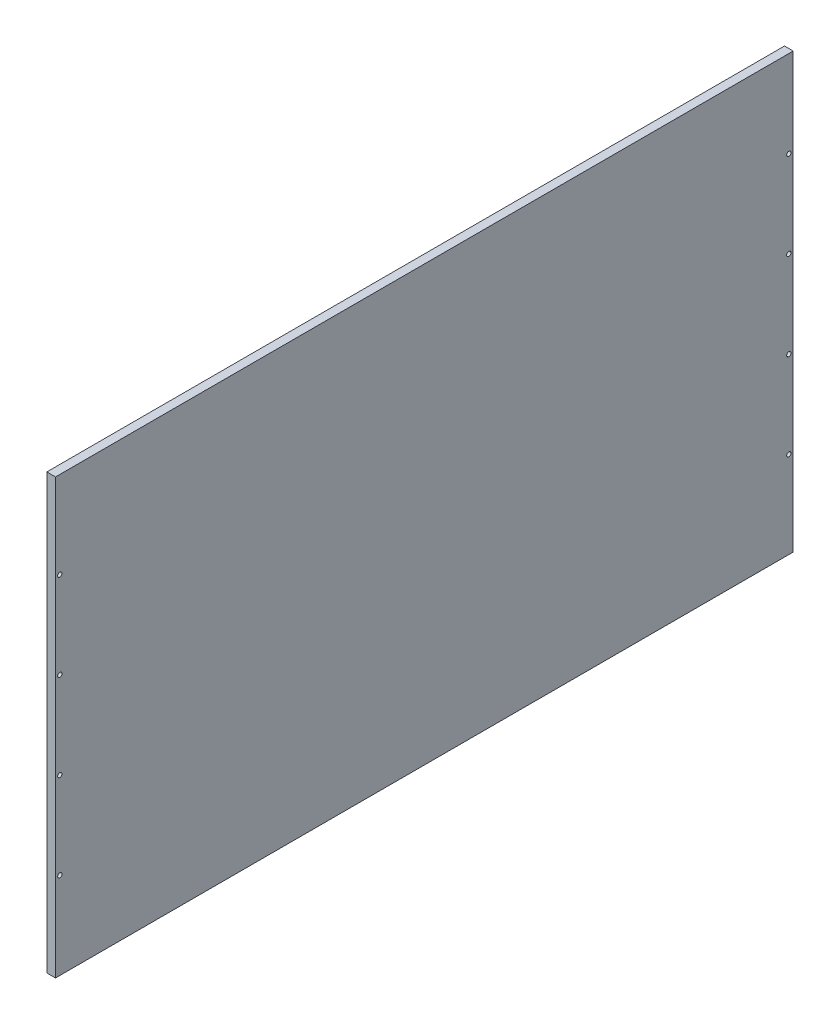
ISO-10303-21;
HEADER;
FILE_DESCRIPTION(('STEP AP214'),'2;1');
FILE_NAME('part.step','',(''),(''),'','','');
FILE_SCHEMA(('AUTOMOTIVE_DESIGN { 1 0 10303 214 1 1 1 1 }'));
ENDSEC;
DATA;
#1=APPLICATION_CONTEXT('core data for automotive mechanical design processes');
#2=APPLICATION_PROTOCOL_DEFINITION('international standard','automotive_design',2000,#1);
#3=PRODUCT_CONTEXT('',#1,'mechanical');
#4=PRODUCT('Part','Part','',(#3));
#5=PRODUCT_RELATED_PRODUCT_CATEGORY('part','',(#4));
#6=PRODUCT_DEFINITION_FORMATION('','',#4);
#7=PRODUCT_DEFINITION_CONTEXT('part definition',#1,'design');
#8=PRODUCT_DEFINITION('design','',#6,#7);
#9=PRODUCT_DEFINITION_SHAPE('','',#8);
#10=(LENGTH_UNIT() NAMED_UNIT(*) SI_UNIT(.MILLI.,.METRE.));
#11=(NAMED_UNIT(*) PLANE_ANGLE_UNIT() SI_UNIT($,.RADIAN.));
#12=(NAMED_UNIT(*) SI_UNIT($,.STERADIAN.) SOLID_ANGLE_UNIT());
#13=UNCERTAINTY_MEASURE_WITH_UNIT(LENGTH_MEASURE(1.E-05),#10,'distance_accuracy_value','');
#14=(GEOMETRIC_REPRESENTATION_CONTEXT(3) GLOBAL_UNCERTAINTY_ASSIGNED_CONTEXT((#13)) GLOBAL_UNIT_ASSIGNED_CONTEXT((#10,
#11,#12)) REPRESENTATION_CONTEXT('',''));
#15=CARTESIAN_POINT('',(0.,0.,0.));
#16=DIRECTION('',(0.,0.,1.));
#17=DIRECTION('',(1.,0.,0.));
#18=AXIS2_PLACEMENT_3D('',#15,#16,#17);
#19=CARTESIAN_POINT('',(5.,-250.,-425.));
#20=DIRECTION('',(0.,0.,1.));
#21=DIRECTION('',(1.,0.,0.));
#22=AXIS2_PLACEMENT_3D('',#19,#20,#21);
#23=PLANE('',#22);
#24=DIRECTION('',(0.,1.,0.));
#25=VECTOR('',#24,1.);
#26=CARTESIAN_POINT('',(-5.,-250.,-425.));
#27=LINE('',#26,#25);
#28=CARTESIAN_POINT('',(-5.,-250.,-425.));
#29=VERTEX_POINT('',#28);
#30=CARTESIAN_POINT('',(-5.,250.,-425.));
#31=VERTEX_POINT('',#30);
#32=EDGE_CURVE('E96',#29,#31,#27,.T.);
#33=ORIENTED_EDGE('',*,*,#32,.T.);
#34=DIRECTION('',(-1.,0.,0.));
#35=VECTOR('',#34,1.);
#36=CARTESIAN_POINT('',(5.,250.,-425.));
#37=LINE('',#36,#35);
#38=CARTESIAN_POINT('',(5.,250.,-425.));
#39=VERTEX_POINT('',#38);
#40=EDGE_CURVE('E11',#39,#31,#37,.T.);
#41=ORIENTED_EDGE('',*,*,#40,.F.);
#42=DIRECTION('',(0.,1.,0.));
#43=VECTOR('',#42,1.);
#44=CARTESIAN_POINT('',(5.,-250.,-425.));
#45=LINE('',#44,#43);
#46=CARTESIAN_POINT('',(5.,-250.,-425.));
#47=VERTEX_POINT('',#46);
#48=EDGE_CURVE('E84',#47,#39,#45,.T.);
#49=ORIENTED_EDGE('',*,*,#48,.F.);
#50=DIRECTION('',(-1.,0.,0.));
#51=VECTOR('',#50,1.);
#52=CARTESIAN_POINT('',(5.,-250.,-425.));
#53=LINE('',#52,#51);
#54=EDGE_CURVE('E92',#47,#29,#53,.T.);
#55=ORIENTED_EDGE('',*,*,#54,.T.);
#56=EDGE_LOOP('',(#33,#41,#49,#55));
#57=FACE_BOUND('',#56,.T.);
#58=ADVANCED_FACE('F33',(#57),#23,.F.);
#59=CARTESIAN_POINT('',(5.,250.,425.));
#60=DIRECTION('',(0.,-1.,0.));
#61=DIRECTION('',(0.,0.,-1.));
#62=AXIS2_PLACEMENT_3D('',#59,#60,#61);
#63=PLANE('',#62);
#64=DIRECTION('',(0.,0.,1.));
#65=VECTOR('',#64,1.);
#66=CARTESIAN_POINT('',(-5.,250.,425.));
#67=LINE('',#66,#65);
#68=CARTESIAN_POINT('',(-5.,250.,425.));
#69=VERTEX_POINT('',#68);
#70=EDGE_CURVE('E88',#31,#69,#67,.T.);
#71=ORIENTED_EDGE('',*,*,#70,.T.);
#72=DIRECTION('',(-1.,0.,0.));
#73=VECTOR('',#72,1.);
#74=CARTESIAN_POINT('',(5.,250.,425.));
#75=LINE('',#74,#73);
#76=CARTESIAN_POINT('',(5.,250.,425.));
#77=VERTEX_POINT('',#76);
#78=EDGE_CURVE('E41',#77,#69,#75,.T.);
#79=ORIENTED_EDGE('',*,*,#78,.F.);
#80=DIRECTION('',(0.,0.,1.));
#81=VECTOR('',#80,1.);
#82=CARTESIAN_POINT('',(5.,250.,425.));
#83=LINE('',#82,#81);
#84=EDGE_CURVE('E79',#39,#77,#83,.T.);
#85=ORIENTED_EDGE('',*,*,#84,.F.);
#86=ORIENTED_EDGE('',*,*,#40,.T.);
#87=EDGE_LOOP('',(#71,#79,#85,#86));
#88=FACE_BOUND('',#87,.T.);
#89=ADVANCED_FACE('F87',(#88),#63,.F.);
#90=CARTESIAN_POINT('',(5.,-250.,425.));
#91=DIRECTION('',(0.,0.,-1.));
#92=DIRECTION('',(-1.,0.,0.));
#93=AXIS2_PLACEMENT_3D('',#90,#91,#92);
#94=PLANE('',#93);
#95=DIRECTION('',(0.,-1.,0.));
#96=VECTOR('',#95,1.);
#97=CARTESIAN_POINT('',(-5.,-250.,425.));
#98=LINE('',#97,#96);
#99=CARTESIAN_POINT('',(-5.,-250.,425.));
#100=VERTEX_POINT('',#99);
#101=EDGE_CURVE('E66',#69,#100,#98,.T.);
#102=ORIENTED_EDGE('',*,*,#101,.T.);
#103=DIRECTION('',(-1.,0.,0.));
#104=VECTOR('',#103,1.);
#105=CARTESIAN_POINT('',(5.,-250.,425.));
#106=LINE('',#105,#104);
#107=CARTESIAN_POINT('',(5.,-250.,425.));
#108=VERTEX_POINT('',#107);
#109=EDGE_CURVE('E89',#108,#100,#106,.T.);
#110=ORIENTED_EDGE('',*,*,#109,.F.);
#111=DIRECTION('',(0.,-1.,0.));
#112=VECTOR('',#111,1.);
#113=CARTESIAN_POINT('',(5.,-250.,425.));
#114=LINE('',#113,#112);
#115=EDGE_CURVE('E82',#77,#108,#114,.T.);
#116=ORIENTED_EDGE('',*,*,#115,.F.);
#117=ORIENTED_EDGE('',*,*,#78,.T.);
#118=EDGE_LOOP('',(#102,#110,#116,#117));
#119=FACE_BOUND('',#118,.T.);
#120=ADVANCED_FACE('F90',(#119),#94,.F.);
#121=CARTESIAN_POINT('',(5.,-250.,425.));
#122=DIRECTION('',(0.,1.,0.));
#123=DIRECTION('',(0.,0.,1.));
#124=AXIS2_PLACEMENT_3D('',#121,#122,#123);
#125=PLANE('',#124);
#126=CARTESIAN_POINT('',(-2.3460250607975E-12,-250.,325.));
#127=DIRECTION('',(0.,-1.,0.));
#128=DIRECTION('',(0.,0.,-1.));
#129=AXIS2_PLACEMENT_3D('',#126,#127,#128);
#130=CIRCLE('',#129,2.5);
#131=CARTESIAN_POINT('',(-2.3460250607975E-12,-250.,322.5));
#132=VERTEX_POINT('',#131);
#133=EDGE_CURVE('E152',#132,#132,#130,.T.);
#134=ORIENTED_EDGE('',*,*,#133,.F.);
#135=EDGE_LOOP('',(#134));
#136=FACE_BOUND('',#135,.T.);
#137=CARTESIAN_POINT('',(-1.99687692691319E-12,-250.,225.));
#138=DIRECTION('',(0.,-1.,0.));
#139=DIRECTION('',(0.,0.,-1.));
#140=AXIS2_PLACEMENT_3D('',#137,#138,#139);
#141=CIRCLE('',#140,2.5);
#142=CARTESIAN_POINT('',(-1.99687692691319E-12,-250.,222.5));
#143=VERTEX_POINT('',#142);
#144=EDGE_CURVE('E146',#143,#143,#141,.T.);
#145=ORIENTED_EDGE('',*,*,#144,.F.);
#146=EDGE_LOOP('',(#145));
#147=FACE_BOUND('',#146,.T.);
#148=CARTESIAN_POINT('',(-1.64772879302888E-12,-250.,125.));
#149=DIRECTION('',(0.,-1.,0.));
#150=DIRECTION('',(0.,0.,-1.));
#151=AXIS2_PLACEMENT_3D('',#148,#149,#150);
#152=CIRCLE('',#151,2.5);
#153=CARTESIAN_POINT('',(-1.64772879302888E-12,-250.,122.5));
#154=VERTEX_POINT('',#153);
#155=EDGE_CURVE('E140',#154,#154,#152,.T.);
#156=ORIENTED_EDGE('',*,*,#155,.F.);
#157=EDGE_LOOP('',(#156));
#158=FACE_BOUND('',#157,.T.);
#159=CARTESIAN_POINT('',(-1.29858065914456E-12,-250.,25.0000000000001));
#160=DIRECTION('',(0.,-1.,0.));
#161=DIRECTION('',(0.,0.,-1.));
#162=AXIS2_PLACEMENT_3D('',#159,#160,#161);
#163=CIRCLE('',#162,2.5);
#164=CARTESIAN_POINT('',(-1.29858065914456E-12,-250.,22.5000000000001));
#165=VERTEX_POINT('',#164);
#166=EDGE_CURVE('E134',#165,#165,#163,.T.);
#167=ORIENTED_EDGE('',*,*,#166,.F.);
#168=EDGE_LOOP('',(#167));
#169=FACE_BOUND('',#168,.T.);
#170=CARTESIAN_POINT('',(-9.4943252526025E-13,-250.,-74.9999999999998));
#171=DIRECTION('',(0.,-1.,0.));
#172=DIRECTION('',(0.,0.,-1.));
#173=AXIS2_PLACEMENT_3D('',#170,#171,#172);
#174=CIRCLE('',#173,2.5);
#175=CARTESIAN_POINT('',(-9.4943252526025E-13,-250.,-77.4999999999998));
#176=VERTEX_POINT('',#175);
#177=EDGE_CURVE('E128',#176,#176,#174,.T.);
#178=ORIENTED_EDGE('',*,*,#177,.F.);
#179=EDGE_LOOP('',(#178));
#180=FACE_BOUND('',#179,.T.);
#181=CARTESIAN_POINT('',(-6.00284391375937E-13,-250.,-175.));
#182=DIRECTION('',(0.,-1.,0.));
#183=DIRECTION('',(0.,0.,-1.));
#184=AXIS2_PLACEMENT_3D('',#181,#182,#183);
#185=CIRCLE('',#184,2.5);
#186=CARTESIAN_POINT('',(-6.00284391375937E-13,-250.,-177.5));
#187=VERTEX_POINT('',#186);
#188=EDGE_CURVE('E122',#187,#187,#185,.T.);
#189=ORIENTED_EDGE('',*,*,#188,.F.);
#190=EDGE_LOOP('',(#189));
#191=FACE_BOUND('',#190,.T.);
#192=CARTESIAN_POINT('',(-2.51136257491624E-13,-250.,-275.));
#193=DIRECTION('',(0.,-1.,0.));
#194=DIRECTION('',(0.,0.,-1.));
#195=AXIS2_PLACEMENT_3D('',#192,#193,#194);
#196=CIRCLE('',#195,2.5);
#197=CARTESIAN_POINT('',(-2.51136257491624E-13,-250.,-277.5));
#198=VERTEX_POINT('',#197);
#199=EDGE_CURVE('E116',#198,#198,#196,.T.);
#200=ORIENTED_EDGE('',*,*,#199,.F.);
#201=EDGE_LOOP('',(#200));
#202=FACE_BOUND('',#201,.T.);
#203=CARTESIAN_POINT('',(0.,-250.,-375.));
#204=DIRECTION('',(0.,-1.,0.));
#205=DIRECTION('',(0.,0.,-1.));
#206=AXIS2_PLACEMENT_3D('',#203,#204,#205);
#207=CIRCLE('',#206,2.5);
#208=CARTESIAN_POINT('',(0.,-250.,-377.5));
#209=VERTEX_POINT('',#208);
#210=EDGE_CURVE('E110',#209,#209,#207,.T.);
#211=ORIENTED_EDGE('',*,*,#210,.F.);
#212=EDGE_LOOP('',(#211));
#213=FACE_BOUND('',#212,.T.);
#214=DIRECTION('',(0.,0.,-1.));
#215=VECTOR('',#214,1.);
#216=CARTESIAN_POINT('',(-5.,-250.,425.));
#217=LINE('',#216,#215);
#218=EDGE_CURVE('E72',#100,#29,#217,.T.);
#219=ORIENTED_EDGE('',*,*,#218,.T.);
#220=ORIENTED_EDGE('',*,*,#54,.F.);
#221=DIRECTION('',(0.,0.,-1.));
#222=VECTOR('',#221,1.);
#223=CARTESIAN_POINT('',(5.,-250.,425.));
#224=LINE('',#223,#222);
#225=EDGE_CURVE('E49',#108,#47,#224,.T.);
#226=ORIENTED_EDGE('',*,*,#225,.F.);
#227=ORIENTED_EDGE('',*,*,#109,.T.);
#228=EDGE_LOOP('',(#219,#220,#226,#227));
#229=FACE_BOUND('',#228,.T.);
#230=ADVANCED_FACE('F104',(#136,#147,#158,#169,#180,#191,#202,#213,#229),#125,.F.);
#231=CARTESIAN_POINT('',(5.,0.,0.));
#232=DIRECTION('',(-1.,0.,0.));
#233=DIRECTION('',(0.,0.,1.));
#234=AXIS2_PLACEMENT_3D('',#231,#232,#233);
#235=PLANE('',#234);
#236=CARTESIAN_POINT('',(5.,-150.,-420.));
#237=DIRECTION('',(1.,0.,0.));
#238=DIRECTION('',(0.,0.,1.));
#239=AXIS2_PLACEMENT_3D('',#236,#237,#238);
#240=CIRCLE('',#239,2.50000000000002);
#241=CARTESIAN_POINT('',(5.,-150.,-417.5));
#242=VERTEX_POINT('',#241);
#243=EDGE_CURVE('E200',#242,#242,#240,.T.);
#244=ORIENTED_EDGE('',*,*,#243,.F.);
#245=EDGE_LOOP('',(#244));
#246=FACE_BOUND('',#245,.T.);
#247=CARTESIAN_POINT('',(5.,-50.,-420.));
#248=DIRECTION('',(1.,0.,0.));
#249=DIRECTION('',(0.,0.,1.));
#250=AXIS2_PLACEMENT_3D('',#247,#248,#249);
#251=CIRCLE('',#250,2.50000000000002);
#252=CARTESIAN_POINT('',(5.,-50.,-417.5));
#253=VERTEX_POINT('',#252);
#254=EDGE_CURVE('E194',#253,#253,#251,.T.);
#255=ORIENTED_EDGE('',*,*,#254,.F.);
#256=EDGE_LOOP('',(#255));
#257=FACE_BOUND('',#256,.T.);
#258=CARTESIAN_POINT('',(5.,50.,-420.000000000001));
#259=DIRECTION('',(1.,0.,0.));
#260=DIRECTION('',(0.,0.,1.));
#261=AXIS2_PLACEMENT_3D('',#258,#259,#260);
#262=CIRCLE('',#261,2.50000000000002);
#263=CARTESIAN_POINT('',(5.,50.,-417.500000000001));
#264=VERTEX_POINT('',#263);
#265=EDGE_CURVE('E188',#264,#264,#262,.T.);
#266=ORIENTED_EDGE('',*,*,#265,.F.);
#267=EDGE_LOOP('',(#266));
#268=FACE_BOUND('',#267,.T.);
#269=CARTESIAN_POINT('',(5.,150.,-420.000000000001));
#270=DIRECTION('',(1.,0.,0.));
#271=DIRECTION('',(0.,0.,1.));
#272=AXIS2_PLACEMENT_3D('',#269,#270,#271);
#273=CIRCLE('',#272,2.50000000000002);
#274=CARTESIAN_POINT('',(5.,150.,-417.500000000001));
#275=VERTEX_POINT('',#274);
#276=EDGE_CURVE('E182',#275,#275,#273,.T.);
#277=ORIENTED_EDGE('',*,*,#276,.F.);
#278=EDGE_LOOP('',(#277));
#279=FACE_BOUND('',#278,.T.);
#280=CARTESIAN_POINT('',(5.,150.,420.000000000001));
#281=DIRECTION('',(1.,0.,0.));
#282=DIRECTION('',(0.,0.,-1.));
#283=AXIS2_PLACEMENT_3D('',#280,#281,#282);
#284=CIRCLE('',#283,2.50000000000002);
#285=CARTESIAN_POINT('',(5.,150.,417.500000000001));
#286=VERTEX_POINT('',#285);
#287=EDGE_CURVE('E176',#286,#286,#284,.T.);
#288=ORIENTED_EDGE('',*,*,#287,.F.);
#289=EDGE_LOOP('',(#288));
#290=FACE_BOUND('',#289,.T.);
#291=CARTESIAN_POINT('',(5.,50.,420.000000000001));
#292=DIRECTION('',(1.,0.,0.));
#293=DIRECTION('',(0.,0.,-1.));
#294=AXIS2_PLACEMENT_3D('',#291,#292,#293);
#295=CIRCLE('',#294,2.50000000000002);
#296=CARTESIAN_POINT('',(5.,50.,417.500000000001));
#297=VERTEX_POINT('',#296);
#298=EDGE_CURVE('E170',#297,#297,#295,.T.);
#299=ORIENTED_EDGE('',*,*,#298,.F.);
#300=EDGE_LOOP('',(#299));
#301=FACE_BOUND('',#300,.T.);
#302=CARTESIAN_POINT('',(5.,-50.,420.));
#303=DIRECTION('',(1.,0.,0.));
#304=DIRECTION('',(0.,0.,-1.));
#305=AXIS2_PLACEMENT_3D('',#302,#303,#304);
#306=CIRCLE('',#305,2.50000000000002);
#307=CARTESIAN_POINT('',(5.,-50.,417.5));
#308=VERTEX_POINT('',#307);
#309=EDGE_CURVE('E164',#308,#308,#306,.T.);
#310=ORIENTED_EDGE('',*,*,#309,.F.);
#311=EDGE_LOOP('',(#310));
#312=FACE_BOUND('',#311,.T.);
#313=CARTESIAN_POINT('',(5.,-150.,420.));
#314=DIRECTION('',(1.,0.,0.));
#315=DIRECTION('',(0.,0.,-1.));
#316=AXIS2_PLACEMENT_3D('',#313,#314,#315);
#317=CIRCLE('',#316,2.50000000000002);
#318=CARTESIAN_POINT('',(5.,-150.,417.5));
#319=VERTEX_POINT('',#318);
#320=EDGE_CURVE('E158',#319,#319,#317,.T.);
#321=ORIENTED_EDGE('',*,*,#320,.F.);
#322=EDGE_LOOP('',(#321));
#323=FACE_BOUND('',#322,.T.);
#324=ORIENTED_EDGE('',*,*,#48,.T.);
#325=ORIENTED_EDGE('',*,*,#84,.T.);
#326=ORIENTED_EDGE('',*,*,#115,.T.);
#327=ORIENTED_EDGE('',*,*,#225,.T.);
#328=EDGE_LOOP('',(#324,#325,#326,#327));
#329=FACE_BOUND('',#328,.T.);
#330=ADVANCED_FACE('F80',(#246,#257,#268,#279,#290,#301,#312,#323,#329),#235,.F.);
#331=CARTESIAN_POINT('',(-5.,0.,0.));
#332=DIRECTION('',(-1.,0.,0.));
#333=DIRECTION('',(0.,0.,1.));
#334=AXIS2_PLACEMENT_3D('',#331,#332,#333);
#335=PLANE('',#334);
#336=ORIENTED_EDGE('',*,*,#32,.F.);
#337=ORIENTED_EDGE('',*,*,#218,.F.);
#338=ORIENTED_EDGE('',*,*,#101,.F.);
#339=ORIENTED_EDGE('',*,*,#70,.F.);
#340=EDGE_LOOP('',(#336,#337,#338,#339));
#341=FACE_BOUND('',#340,.T.);
#342=ADVANCED_FACE('F107',(#341),#335,.T.);
#343=CARTESIAN_POINT('',(0.,-245.,-375.));
#344=DIRECTION('',(0.,-1.,0.));
#345=DIRECTION('',(0.,0.,-1.));
#346=AXIS2_PLACEMENT_3D('',#343,#344,#345);
#347=CYLINDRICAL_SURFACE('',#346,2.5);
#348=CARTESIAN_POINT('',(0.,-245.,-375.));
#349=DIRECTION('',(0.,-1.,0.));
#350=DIRECTION('',(0.,0.,-1.));
#351=AXIS2_PLACEMENT_3D('',#348,#349,#350);
#352=CIRCLE('',#351,2.5);
#353=CARTESIAN_POINT('',(0.,-245.,-377.5));
#354=VERTEX_POINT('',#353);
#355=EDGE_CURVE('E99',#354,#354,#352,.T.);
#356=ORIENTED_EDGE('',*,*,#355,.F.);
#357=EDGE_LOOP('',(#356));
#358=FACE_BOUND('',#357,.T.);
#359=ORIENTED_EDGE('',*,*,#210,.T.);
#360=EDGE_LOOP('',(#359));
#361=FACE_BOUND('',#360,.T.);
#362=ADVANCED_FACE('F262',(#358,#361),#347,.F.);
#363=CARTESIAN_POINT('',(0.,-245.,-375.));
#364=DIRECTION('',(0.,-1.,0.));
#365=DIRECTION('',(0.,0.,-1.));
#366=AXIS2_PLACEMENT_3D('',#363,#364,#365);
#367=PLANE('',#366);
#368=ORIENTED_EDGE('',*,*,#355,.T.);
#369=EDGE_LOOP('',(#368));
#370=FACE_BOUND('',#369,.T.);
#371=ADVANCED_FACE('F266',(#370),#367,.T.);
#372=CARTESIAN_POINT('',(-2.51136257491624E-13,-245.,-275.));
#373=DIRECTION('',(0.,-1.,0.));
#374=DIRECTION('',(0.,0.,-1.));
#375=AXIS2_PLACEMENT_3D('',#372,#373,#374);
#376=CYLINDRICAL_SURFACE('',#375,2.5);
#377=CARTESIAN_POINT('',(-2.51136257491624E-13,-245.,-275.));
#378=DIRECTION('',(0.,-1.,0.));
#379=DIRECTION('',(0.,0.,-1.));
#380=AXIS2_PLACEMENT_3D('',#377,#378,#379);
#381=CIRCLE('',#380,2.5);
#382=CARTESIAN_POINT('',(-2.51136257491624E-13,-245.,-277.5));
#383=VERTEX_POINT('',#382);
#384=EDGE_CURVE('E113',#383,#383,#381,.T.);
#385=ORIENTED_EDGE('',*,*,#384,.F.);
#386=EDGE_LOOP('',(#385));
#387=FACE_BOUND('',#386,.T.);
#388=ORIENTED_EDGE('',*,*,#199,.T.);
#389=EDGE_LOOP('',(#388));
#390=FACE_BOUND('',#389,.T.);
#391=ADVANCED_FACE('F270',(#387,#390),#376,.F.);
#392=CARTESIAN_POINT('',(-2.51136257491624E-13,-245.,-275.));
#393=DIRECTION('',(0.,-1.,0.));
#394=DIRECTION('',(0.,0.,-1.));
#395=AXIS2_PLACEMENT_3D('',#392,#393,#394);
#396=PLANE('',#395);
#397=ORIENTED_EDGE('',*,*,#384,.T.);
#398=EDGE_LOOP('',(#397));
#399=FACE_BOUND('',#398,.T.);
#400=ADVANCED_FACE('F274',(#399),#396,.T.);
#401=CARTESIAN_POINT('',(-6.00284391375937E-13,-245.,-175.));
#402=DIRECTION('',(0.,-1.,0.));
#403=DIRECTION('',(0.,0.,-1.));
#404=AXIS2_PLACEMENT_3D('',#401,#402,#403);
#405=CYLINDRICAL_SURFACE('',#404,2.5);
#406=CARTESIAN_POINT('',(-6.00284391375937E-13,-245.,-175.));
#407=DIRECTION('',(0.,-1.,0.));
#408=DIRECTION('',(0.,0.,-1.));
#409=AXIS2_PLACEMENT_3D('',#406,#407,#408);
#410=CIRCLE('',#409,2.5);
#411=CARTESIAN_POINT('',(-6.00284391375937E-13,-245.,-177.5));
#412=VERTEX_POINT('',#411);
#413=EDGE_CURVE('E119',#412,#412,#410,.T.);
#414=ORIENTED_EDGE('',*,*,#413,.F.);
#415=EDGE_LOOP('',(#414));
#416=FACE_BOUND('',#415,.T.);
#417=ORIENTED_EDGE('',*,*,#188,.T.);
#418=EDGE_LOOP('',(#417));
#419=FACE_BOUND('',#418,.T.);
#420=ADVANCED_FACE('F278',(#416,#419),#405,.F.);
#421=CARTESIAN_POINT('',(-6.00284391375937E-13,-245.,-175.));
#422=DIRECTION('',(0.,-1.,0.));
#423=DIRECTION('',(0.,0.,-1.));
#424=AXIS2_PLACEMENT_3D('',#421,#422,#423);
#425=PLANE('',#424);
#426=ORIENTED_EDGE('',*,*,#413,.T.);
#427=EDGE_LOOP('',(#426));
#428=FACE_BOUND('',#427,.T.);
#429=ADVANCED_FACE('F282',(#428),#425,.T.);
#430=CARTESIAN_POINT('',(-9.4943252526025E-13,-245.,-74.9999999999998));
#431=DIRECTION('',(0.,-1.,0.));
#432=DIRECTION('',(0.,0.,-1.));
#433=AXIS2_PLACEMENT_3D('',#430,#431,#432);
#434=CYLINDRICAL_SURFACE('',#433,2.5);
#435=CARTESIAN_POINT('',(-9.4943252526025E-13,-245.,-74.9999999999998));
#436=DIRECTION('',(0.,-1.,0.));
#437=DIRECTION('',(0.,0.,-1.));
#438=AXIS2_PLACEMENT_3D('',#435,#436,#437);
#439=CIRCLE('',#438,2.5);
#440=CARTESIAN_POINT('',(-9.4943252526025E-13,-245.,-77.4999999999998));
#441=VERTEX_POINT('',#440);
#442=EDGE_CURVE('E125',#441,#441,#439,.T.);
#443=ORIENTED_EDGE('',*,*,#442,.F.);
#444=EDGE_LOOP('',(#443));
#445=FACE_BOUND('',#444,.T.);
#446=ORIENTED_EDGE('',*,*,#177,.T.);
#447=EDGE_LOOP('',(#446));
#448=FACE_BOUND('',#447,.T.);
#449=ADVANCED_FACE('F286',(#445,#448),#434,.F.);
#450=CARTESIAN_POINT('',(-9.4943252526025E-13,-245.,-74.9999999999998));
#451=DIRECTION('',(0.,-1.,0.));
#452=DIRECTION('',(0.,0.,-1.));
#453=AXIS2_PLACEMENT_3D('',#450,#451,#452);
#454=PLANE('',#453);
#455=ORIENTED_EDGE('',*,*,#442,.T.);
#456=EDGE_LOOP('',(#455));
#457=FACE_BOUND('',#456,.T.);
#458=ADVANCED_FACE('F290',(#457),#454,.T.);
#459=CARTESIAN_POINT('',(-1.29858065914456E-12,-245.,25.0000000000001));
#460=DIRECTION('',(0.,-1.,0.));
#461=DIRECTION('',(0.,0.,-1.));
#462=AXIS2_PLACEMENT_3D('',#459,#460,#461);
#463=CYLINDRICAL_SURFACE('',#462,2.5);
#464=CARTESIAN_POINT('',(-1.29858065914456E-12,-245.,25.0000000000001));
#465=DIRECTION('',(0.,-1.,0.));
#466=DIRECTION('',(0.,0.,-1.));
#467=AXIS2_PLACEMENT_3D('',#464,#465,#466);
#468=CIRCLE('',#467,2.5);
#469=CARTESIAN_POINT('',(-1.29858065914456E-12,-245.,22.5000000000001));
#470=VERTEX_POINT('',#469);
#471=EDGE_CURVE('E131',#470,#470,#468,.T.);
#472=ORIENTED_EDGE('',*,*,#471,.F.);
#473=EDGE_LOOP('',(#472));
#474=FACE_BOUND('',#473,.T.);
#475=ORIENTED_EDGE('',*,*,#166,.T.);
#476=EDGE_LOOP('',(#475));
#477=FACE_BOUND('',#476,.T.);
#478=ADVANCED_FACE('F294',(#474,#477),#463,.F.);
#479=CARTESIAN_POINT('',(-1.29858065914456E-12,-245.,25.0000000000001));
#480=DIRECTION('',(0.,-1.,0.));
#481=DIRECTION('',(0.,0.,-1.));
#482=AXIS2_PLACEMENT_3D('',#479,#480,#481);
#483=PLANE('',#482);
#484=ORIENTED_EDGE('',*,*,#471,.T.);
#485=EDGE_LOOP('',(#484));
#486=FACE_BOUND('',#485,.T.);
#487=ADVANCED_FACE('F298',(#486),#483,.T.);
#488=CARTESIAN_POINT('',(-1.64772879302888E-12,-245.,125.));
#489=DIRECTION('',(0.,-1.,0.));
#490=DIRECTION('',(0.,0.,-1.));
#491=AXIS2_PLACEMENT_3D('',#488,#489,#490);
#492=CYLINDRICAL_SURFACE('',#491,2.5);
#493=CARTESIAN_POINT('',(-1.64772879302888E-12,-245.,125.));
#494=DIRECTION('',(0.,-1.,0.));
#495=DIRECTION('',(0.,0.,-1.));
#496=AXIS2_PLACEMENT_3D('',#493,#494,#495);
#497=CIRCLE('',#496,2.5);
#498=CARTESIAN_POINT('',(-1.64772879302888E-12,-245.,122.5));
#499=VERTEX_POINT('',#498);
#500=EDGE_CURVE('E137',#499,#499,#497,.T.);
#501=ORIENTED_EDGE('',*,*,#500,.F.);
#502=EDGE_LOOP('',(#501));
#503=FACE_BOUND('',#502,.T.);
#504=ORIENTED_EDGE('',*,*,#155,.T.);
#505=EDGE_LOOP('',(#504));
#506=FACE_BOUND('',#505,.T.);
#507=ADVANCED_FACE('F302',(#503,#506),#492,.F.);
#508=CARTESIAN_POINT('',(-1.64772879302888E-12,-245.,125.));
#509=DIRECTION('',(0.,-1.,0.));
#510=DIRECTION('',(0.,0.,-1.));
#511=AXIS2_PLACEMENT_3D('',#508,#509,#510);
#512=PLANE('',#511);
#513=ORIENTED_EDGE('',*,*,#500,.T.);
#514=EDGE_LOOP('',(#513));
#515=FACE_BOUND('',#514,.T.);
#516=ADVANCED_FACE('F306',(#515),#512,.T.);
#517=CARTESIAN_POINT('',(-1.99687692691319E-12,-245.,225.));
#518=DIRECTION('',(0.,-1.,0.));
#519=DIRECTION('',(0.,0.,-1.));
#520=AXIS2_PLACEMENT_3D('',#517,#518,#519);
#521=CYLINDRICAL_SURFACE('',#520,2.5);
#522=CARTESIAN_POINT('',(-1.99687692691319E-12,-245.,225.));
#523=DIRECTION('',(0.,-1.,0.));
#524=DIRECTION('',(0.,0.,-1.));
#525=AXIS2_PLACEMENT_3D('',#522,#523,#524);
#526=CIRCLE('',#525,2.5);
#527=CARTESIAN_POINT('',(-1.99687692691319E-12,-245.,222.5));
#528=VERTEX_POINT('',#527);
#529=EDGE_CURVE('E143',#528,#528,#526,.T.);
#530=ORIENTED_EDGE('',*,*,#529,.F.);
#531=EDGE_LOOP('',(#530));
#532=FACE_BOUND('',#531,.T.);
#533=ORIENTED_EDGE('',*,*,#144,.T.);
#534=EDGE_LOOP('',(#533));
#535=FACE_BOUND('',#534,.T.);
#536=ADVANCED_FACE('F310',(#532,#535),#521,.F.);
#537=CARTESIAN_POINT('',(-1.99687692691319E-12,-245.,225.));
#538=DIRECTION('',(0.,-1.,0.));
#539=DIRECTION('',(0.,0.,-1.));
#540=AXIS2_PLACEMENT_3D('',#537,#538,#539);
#541=PLANE('',#540);
#542=ORIENTED_EDGE('',*,*,#529,.T.);
#543=EDGE_LOOP('',(#542));
#544=FACE_BOUND('',#543,.T.);
#545=ADVANCED_FACE('F314',(#544),#541,.T.);
#546=CARTESIAN_POINT('',(-2.3460250607975E-12,-245.,325.));
#547=DIRECTION('',(0.,-1.,0.));
#548=DIRECTION('',(0.,0.,-1.));
#549=AXIS2_PLACEMENT_3D('',#546,#547,#548);
#550=CYLINDRICAL_SURFACE('',#549,2.5);
#551=CARTESIAN_POINT('',(-2.3460250607975E-12,-245.,325.));
#552=DIRECTION('',(0.,-1.,0.));
#553=DIRECTION('',(0.,0.,-1.));
#554=AXIS2_PLACEMENT_3D('',#551,#552,#553);
#555=CIRCLE('',#554,2.5);
#556=CARTESIAN_POINT('',(-2.3460250607975E-12,-245.,322.5));
#557=VERTEX_POINT('',#556);
#558=EDGE_CURVE('E149',#557,#557,#555,.T.);
#559=ORIENTED_EDGE('',*,*,#558,.F.);
#560=EDGE_LOOP('',(#559));
#561=FACE_BOUND('',#560,.T.);
#562=ORIENTED_EDGE('',*,*,#133,.T.);
#563=EDGE_LOOP('',(#562));
#564=FACE_BOUND('',#563,.T.);
#565=ADVANCED_FACE('F245',(#561,#564),#550,.F.);
#566=CARTESIAN_POINT('',(-2.3460250607975E-12,-245.,325.));
#567=DIRECTION('',(0.,-1.,0.));
#568=DIRECTION('',(0.,0.,-1.));
#569=AXIS2_PLACEMENT_3D('',#566,#567,#568);
#570=PLANE('',#569);
#571=ORIENTED_EDGE('',*,*,#558,.T.);
#572=EDGE_LOOP('',(#571));
#573=FACE_BOUND('',#572,.T.);
#574=ADVANCED_FACE('F235',(#573),#570,.T.);
#575=CARTESIAN_POINT('',(0.,-150.,420.));
#576=DIRECTION('',(1.,0.,0.));
#577=DIRECTION('',(0.,0.,-1.));
#578=AXIS2_PLACEMENT_3D('',#575,#576,#577);
#579=CYLINDRICAL_SURFACE('',#578,2.50000000000002);
#580=CARTESIAN_POINT('',(0.,-150.,420.));
#581=DIRECTION('',(1.,0.,0.));
#582=DIRECTION('',(0.,0.,-1.));
#583=AXIS2_PLACEMENT_3D('',#580,#581,#582);
#584=CIRCLE('',#583,2.50000000000002);
#585=CARTESIAN_POINT('',(0.,-150.,417.5));
#586=VERTEX_POINT('',#585);
#587=EDGE_CURVE('E155',#586,#586,#584,.T.);
#588=ORIENTED_EDGE('',*,*,#587,.F.);
#589=EDGE_LOOP('',(#588));
#590=FACE_BOUND('',#589,.T.);
#591=ORIENTED_EDGE('',*,*,#320,.T.);
#592=EDGE_LOOP('',(#591));
#593=FACE_BOUND('',#592,.T.);
#594=ADVANCED_FACE('F232',(#590,#593),#579,.F.);
#595=CARTESIAN_POINT('',(0.,-150.,420.));
#596=DIRECTION('',(1.,0.,0.));
#597=DIRECTION('',(0.,0.,-1.));
#598=AXIS2_PLACEMENT_3D('',#595,#596,#597);
#599=PLANE('',#598);
#600=ORIENTED_EDGE('',*,*,#587,.T.);
#601=EDGE_LOOP('',(#600));
#602=FACE_BOUND('',#601,.T.);
#603=ADVANCED_FACE('F234',(#602),#599,.T.);
#604=CARTESIAN_POINT('',(0.,-50.,420.));
#605=DIRECTION('',(1.,0.,0.));
#606=DIRECTION('',(0.,0.,-1.));
#607=AXIS2_PLACEMENT_3D('',#604,#605,#606);
#608=CYLINDRICAL_SURFACE('',#607,2.50000000000002);
#609=CARTESIAN_POINT('',(0.,-50.,420.));
#610=DIRECTION('',(1.,0.,0.));
#611=DIRECTION('',(0.,0.,-1.));
#612=AXIS2_PLACEMENT_3D('',#609,#610,#611);
#613=CIRCLE('',#612,2.50000000000002);
#614=CARTESIAN_POINT('',(0.,-50.,417.5));
#615=VERTEX_POINT('',#614);
#616=EDGE_CURVE('E161',#615,#615,#613,.T.);
#617=ORIENTED_EDGE('',*,*,#616,.F.);
#618=EDGE_LOOP('',(#617));
#619=FACE_BOUND('',#618,.T.);
#620=ORIENTED_EDGE('',*,*,#309,.T.);
#621=EDGE_LOOP('',(#620));
#622=FACE_BOUND('',#621,.T.);
#623=ADVANCED_FACE('F242',(#619,#622),#608,.F.);
#624=CARTESIAN_POINT('',(0.,-50.,420.));
#625=DIRECTION('',(1.,0.,0.));
#626=DIRECTION('',(0.,0.,-1.));
#627=AXIS2_PLACEMENT_3D('',#624,#625,#626);
#628=PLANE('',#627);
#629=ORIENTED_EDGE('',*,*,#616,.T.);
#630=EDGE_LOOP('',(#629));
#631=FACE_BOUND('',#630,.T.);
#632=ADVANCED_FACE('F380',(#631),#628,.T.);
#633=CARTESIAN_POINT('',(0.,50.,420.000000000001));
#634=DIRECTION('',(1.,0.,0.));
#635=DIRECTION('',(0.,0.,-1.));
#636=AXIS2_PLACEMENT_3D('',#633,#634,#635);
#637=CYLINDRICAL_SURFACE('',#636,2.50000000000002);
#638=CARTESIAN_POINT('',(0.,50.,420.000000000001));
#639=DIRECTION('',(1.,0.,0.));
#640=DIRECTION('',(0.,0.,-1.));
#641=AXIS2_PLACEMENT_3D('',#638,#639,#640);
#642=CIRCLE('',#641,2.50000000000002);
#643=CARTESIAN_POINT('',(0.,50.,417.500000000001));
#644=VERTEX_POINT('',#643);
#645=EDGE_CURVE('E167',#644,#644,#642,.T.);
#646=ORIENTED_EDGE('',*,*,#645,.F.);
#647=EDGE_LOOP('',(#646));
#648=FACE_BOUND('',#647,.T.);
#649=ORIENTED_EDGE('',*,*,#298,.T.);
#650=EDGE_LOOP('',(#649));
#651=FACE_BOUND('',#650,.T.);
#652=ADVANCED_FACE('F390',(#648,#651),#637,.F.);
#653=CARTESIAN_POINT('',(0.,50.,420.000000000001));
#654=DIRECTION('',(1.,0.,0.));
#655=DIRECTION('',(0.,0.,-1.));
#656=AXIS2_PLACEMENT_3D('',#653,#654,#655);
#657=PLANE('',#656);
#658=ORIENTED_EDGE('',*,*,#645,.T.);
#659=EDGE_LOOP('',(#658));
#660=FACE_BOUND('',#659,.T.);
#661=ADVANCED_FACE('F400',(#660),#657,.T.);
#662=CARTESIAN_POINT('',(0.,150.,420.000000000001));
#663=DIRECTION('',(1.,0.,0.));
#664=DIRECTION('',(0.,0.,-1.));
#665=AXIS2_PLACEMENT_3D('',#662,#663,#664);
#666=CYLINDRICAL_SURFACE('',#665,2.50000000000002);
#667=CARTESIAN_POINT('',(0.,150.,420.000000000001));
#668=DIRECTION('',(1.,0.,0.));
#669=DIRECTION('',(0.,0.,-1.));
#670=AXIS2_PLACEMENT_3D('',#667,#668,#669);
#671=CIRCLE('',#670,2.50000000000002);
#672=CARTESIAN_POINT('',(0.,150.,417.500000000001));
#673=VERTEX_POINT('',#672);
#674=EDGE_CURVE('E173',#673,#673,#671,.T.);
#675=ORIENTED_EDGE('',*,*,#674,.F.);
#676=EDGE_LOOP('',(#675));
#677=FACE_BOUND('',#676,.T.);
#678=ORIENTED_EDGE('',*,*,#287,.T.);
#679=EDGE_LOOP('',(#678));
#680=FACE_BOUND('',#679,.T.);
#681=ADVANCED_FACE('F410',(#677,#680),#666,.F.);
#682=CARTESIAN_POINT('',(0.,150.,420.000000000001));
#683=DIRECTION('',(1.,0.,0.));
#684=DIRECTION('',(0.,0.,-1.));
#685=AXIS2_PLACEMENT_3D('',#682,#683,#684);
#686=PLANE('',#685);
#687=ORIENTED_EDGE('',*,*,#674,.T.);
#688=EDGE_LOOP('',(#687));
#689=FACE_BOUND('',#688,.T.);
#690=ADVANCED_FACE('F420',(#689),#686,.T.);
#691=CARTESIAN_POINT('',(0.,150.,-420.000000000001));
#692=DIRECTION('',(1.,0.,0.));
#693=DIRECTION('',(0.,0.,-1.));
#694=AXIS2_PLACEMENT_3D('',#691,#692,#693);
#695=CYLINDRICAL_SURFACE('',#694,2.50000000000002);
#696=CARTESIAN_POINT('',(0.,150.,-420.000000000001));
#697=DIRECTION('',(1.,0.,0.));
#698=DIRECTION('',(0.,0.,1.));
#699=AXIS2_PLACEMENT_3D('',#696,#697,#698);
#700=CIRCLE('',#699,2.50000000000002);
#701=CARTESIAN_POINT('',(0.,150.,-417.500000000001));
#702=VERTEX_POINT('',#701);
#703=EDGE_CURVE('E179',#702,#702,#700,.T.);
#704=ORIENTED_EDGE('',*,*,#703,.F.);
#705=EDGE_LOOP('',(#704));
#706=FACE_BOUND('',#705,.T.);
#707=ORIENTED_EDGE('',*,*,#276,.T.);
#708=EDGE_LOOP('',(#707));
#709=FACE_BOUND('',#708,.T.);
#710=ADVANCED_FACE('F430',(#706,#709),#695,.F.);
#711=CARTESIAN_POINT('',(0.,150.,-420.000000000001));
#712=DIRECTION('',(-1.,0.,0.));
#713=DIRECTION('',(0.,0.,1.));
#714=AXIS2_PLACEMENT_3D('',#711,#712,#713);
#715=PLANE('',#714);
#716=ORIENTED_EDGE('',*,*,#703,.T.);
#717=EDGE_LOOP('',(#716));
#718=FACE_BOUND('',#717,.T.);
#719=ADVANCED_FACE('F440',(#718),#715,.F.);
#720=CARTESIAN_POINT('',(0.,50.,-420.000000000001));
#721=DIRECTION('',(1.,0.,0.));
#722=DIRECTION('',(0.,0.,-1.));
#723=AXIS2_PLACEMENT_3D('',#720,#721,#722);
#724=CYLINDRICAL_SURFACE('',#723,2.50000000000002);
#725=CARTESIAN_POINT('',(0.,50.,-420.000000000001));
#726=DIRECTION('',(1.,0.,0.));
#727=DIRECTION('',(0.,0.,1.));
#728=AXIS2_PLACEMENT_3D('',#725,#726,#727);
#729=CIRCLE('',#728,2.50000000000002);
#730=CARTESIAN_POINT('',(0.,50.,-417.500000000001));
#731=VERTEX_POINT('',#730);
#732=EDGE_CURVE('E185',#731,#731,#729,.T.);
#733=ORIENTED_EDGE('',*,*,#732,.F.);
#734=EDGE_LOOP('',(#733));
#735=FACE_BOUND('',#734,.T.);
#736=ORIENTED_EDGE('',*,*,#265,.T.);
#737=EDGE_LOOP('',(#736));
#738=FACE_BOUND('',#737,.T.);
#739=ADVANCED_FACE('F450',(#735,#738),#724,.F.);
#740=CARTESIAN_POINT('',(0.,50.,-420.000000000001));
#741=DIRECTION('',(-1.,0.,0.));
#742=DIRECTION('',(0.,0.,1.));
#743=AXIS2_PLACEMENT_3D('',#740,#741,#742);
#744=PLANE('',#743);
#745=ORIENTED_EDGE('',*,*,#732,.T.);
#746=EDGE_LOOP('',(#745));
#747=FACE_BOUND('',#746,.T.);
#748=ADVANCED_FACE('F460',(#747),#744,.F.);
#749=CARTESIAN_POINT('',(0.,-50.,-420.));
#750=DIRECTION('',(1.,0.,0.));
#751=DIRECTION('',(0.,0.,-1.));
#752=AXIS2_PLACEMENT_3D('',#749,#750,#751);
#753=CYLINDRICAL_SURFACE('',#752,2.50000000000002);
#754=CARTESIAN_POINT('',(0.,-50.,-420.));
#755=DIRECTION('',(1.,0.,0.));
#756=DIRECTION('',(0.,0.,1.));
#757=AXIS2_PLACEMENT_3D('',#754,#755,#756);
#758=CIRCLE('',#757,2.50000000000002);
#759=CARTESIAN_POINT('',(0.,-50.,-417.5));
#760=VERTEX_POINT('',#759);
#761=EDGE_CURVE('E191',#760,#760,#758,.T.);
#762=ORIENTED_EDGE('',*,*,#761,.F.);
#763=EDGE_LOOP('',(#762));
#764=FACE_BOUND('',#763,.T.);
#765=ORIENTED_EDGE('',*,*,#254,.T.);
#766=EDGE_LOOP('',(#765));
#767=FACE_BOUND('',#766,.T.);
#768=ADVANCED_FACE('F470',(#764,#767),#753,.F.);
#769=CARTESIAN_POINT('',(0.,-50.,-420.));
#770=DIRECTION('',(-1.,0.,0.));
#771=DIRECTION('',(0.,0.,1.));
#772=AXIS2_PLACEMENT_3D('',#769,#770,#771);
#773=PLANE('',#772);
#774=ORIENTED_EDGE('',*,*,#761,.T.);
#775=EDGE_LOOP('',(#774));
#776=FACE_BOUND('',#775,.T.);
#777=ADVANCED_FACE('F211',(#776),#773,.F.);
#778=CARTESIAN_POINT('',(0.,-150.,-420.));
#779=DIRECTION('',(1.,0.,0.));
#780=DIRECTION('',(0.,0.,-1.));
#781=AXIS2_PLACEMENT_3D('',#778,#779,#780);
#782=CYLINDRICAL_SURFACE('',#781,2.50000000000002);
#783=CARTESIAN_POINT('',(0.,-150.,-420.));
#784=DIRECTION('',(1.,0.,0.));
#785=DIRECTION('',(0.,0.,1.));
#786=AXIS2_PLACEMENT_3D('',#783,#784,#785);
#787=CIRCLE('',#786,2.50000000000002);
#788=CARTESIAN_POINT('',(0.,-150.,-417.5));
#789=VERTEX_POINT('',#788);
#790=EDGE_CURVE('E197',#789,#789,#787,.T.);
#791=ORIENTED_EDGE('',*,*,#790,.F.);
#792=EDGE_LOOP('',(#791));
#793=FACE_BOUND('',#792,.T.);
#794=ORIENTED_EDGE('',*,*,#243,.T.);
#795=EDGE_LOOP('',(#794));
#796=FACE_BOUND('',#795,.T.);
#797=ADVANCED_FACE('F208',(#793,#796),#782,.F.);
#798=CARTESIAN_POINT('',(0.,-150.,-420.));
#799=DIRECTION('',(-1.,0.,0.));
#800=DIRECTION('',(0.,0.,1.));
#801=AXIS2_PLACEMENT_3D('',#798,#799,#800);
#802=PLANE('',#801);
#803=ORIENTED_EDGE('',*,*,#790,.T.);
#804=EDGE_LOOP('',(#803));
#805=FACE_BOUND('',#804,.T.);
#806=ADVANCED_FACE('F206',(#805),#802,.F.);
#807=CLOSED_SHELL('',(#58,#89,#120,#230,#330,#342,#362,#371,#391,#400,#420,#429,#449,#458,#478,
#487,#507,#516,#536,#545,#565,#574,#594,#603,#623,#632,#652,#661,#681,#690,#710,#719,#739,#748,
#768,#777,#797,#806));
#808=MANIFOLD_SOLID_BREP('B2',#807);
#809=ADVANCED_BREP_SHAPE_REPRESENTATION('',(#18,#808),#14);
#810=SHAPE_DEFINITION_REPRESENTATION(#9,#809);
ENDSEC;
END-ISO-10303-21;
